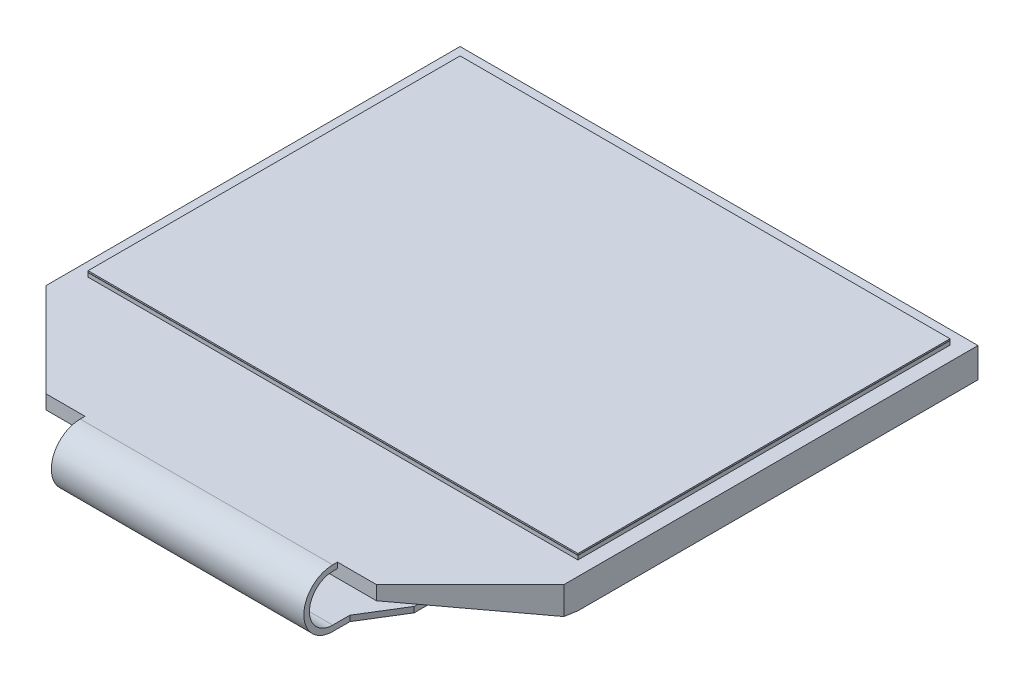
ISO-10303-21;
HEADER;
FILE_DESCRIPTION(('STEP AP214'),'2;1');
FILE_NAME('part.step','',(''),(''),'','','');
FILE_SCHEMA(('AUTOMOTIVE_DESIGN { 1 0 10303 214 1 1 1 1 }'));
ENDSEC;
DATA;
#1=APPLICATION_CONTEXT('core data for automotive mechanical design processes');
#2=APPLICATION_PROTOCOL_DEFINITION('international standard','automotive_design',2000,#1);
#3=PRODUCT_CONTEXT('',#1,'mechanical');
#4=PRODUCT('Part','Part','',(#3));
#5=PRODUCT_RELATED_PRODUCT_CATEGORY('part','',(#4));
#6=PRODUCT_DEFINITION_FORMATION('','',#4);
#7=PRODUCT_DEFINITION_CONTEXT('part definition',#1,'design');
#8=PRODUCT_DEFINITION('design','',#6,#7);
#9=PRODUCT_DEFINITION_SHAPE('','',#8);
#10=(LENGTH_UNIT() NAMED_UNIT(*) SI_UNIT(.MILLI.,.METRE.));
#11=(NAMED_UNIT(*) PLANE_ANGLE_UNIT() SI_UNIT($,.RADIAN.));
#12=(NAMED_UNIT(*) SI_UNIT($,.STERADIAN.) SOLID_ANGLE_UNIT());
#13=UNCERTAINTY_MEASURE_WITH_UNIT(LENGTH_MEASURE(1.E-05),#10,'distance_accuracy_value','');
#14=(GEOMETRIC_REPRESENTATION_CONTEXT(3) GLOBAL_UNCERTAINTY_ASSIGNED_CONTEXT((#13)) GLOBAL_UNIT_ASSIGNED_CONTEXT((#10,
#11,#12)) REPRESENTATION_CONTEXT('',''));
#15=CARTESIAN_POINT('',(0.,0.,0.));
#16=DIRECTION('',(0.,0.,1.));
#17=DIRECTION('',(1.,0.,0.));
#18=AXIS2_PLACEMENT_3D('',#15,#16,#17);
#19=CARTESIAN_POINT('',(8.73,0.71,0.5));
#20=DIRECTION('',(0.,0.,1.));
#21=DIRECTION('',(1.,0.,0.));
#22=AXIS2_PLACEMENT_3D('',#19,#20,#21);
#23=PLANE('',#22);
#24=DIRECTION('',(-1.,0.,0.));
#25=VECTOR('',#24,1.);
#26=CARTESIAN_POINT('',(8.73,0.66,0.5));
#27=LINE('',#26,#25);
#28=CARTESIAN_POINT('',(8.73,0.66,0.5));
#29=VERTEX_POINT('',#28);
#30=CARTESIAN_POINT('',(-8.73,0.66,0.5));
#31=VERTEX_POINT('',#30);
#32=EDGE_CURVE('E108',#29,#31,#27,.T.);
#33=ORIENTED_EDGE('',*,*,#32,.T.);
#34=DIRECTION('',(0.,-1.,0.));
#35=VECTOR('',#34,1.);
#36=CARTESIAN_POINT('',(-8.73,0.71,0.5));
#37=LINE('',#36,#35);
#38=CARTESIAN_POINT('',(-8.73,0.71,0.5));
#39=VERTEX_POINT('',#38);
#40=EDGE_CURVE('E106',#39,#31,#37,.T.);
#41=ORIENTED_EDGE('',*,*,#40,.F.);
#42=DIRECTION('',(-1.,0.,0.));
#43=VECTOR('',#42,1.);
#44=CARTESIAN_POINT('',(8.73,0.71,0.5));
#45=LINE('',#44,#43);
#46=CARTESIAN_POINT('',(8.73,0.71,0.5));
#47=VERTEX_POINT('',#46);
#48=EDGE_CURVE('E92',#47,#39,#45,.T.);
#49=ORIENTED_EDGE('',*,*,#48,.F.);
#50=DIRECTION('',(0.,-1.,0.));
#51=VECTOR('',#50,1.);
#52=CARTESIAN_POINT('',(8.73,0.71,0.5));
#53=LINE('',#52,#51);
#54=EDGE_CURVE('E60',#47,#29,#53,.T.);
#55=ORIENTED_EDGE('',*,*,#54,.T.);
#56=EDGE_LOOP('',(#33,#41,#49,#55));
#57=FACE_BOUND('',#56,.T.);
#58=ADVANCED_FACE('F52',(#57),#23,.F.);
#59=CARTESIAN_POINT('',(0.,0.71,13.76));
#60=DIRECTION('',(0.,0.,-1.));
#61=DIRECTION('',(-1.,0.,0.));
#62=AXIS2_PLACEMENT_3D('',#59,#60,#61);
#63=PLANE('',#62);
#64=DIRECTION('',(1.,0.,0.));
#65=VECTOR('',#64,1.);
#66=CARTESIAN_POINT('',(0.,0.66,13.76));
#67=LINE('',#66,#65);
#68=CARTESIAN_POINT('',(-8.73,0.66,13.76));
#69=VERTEX_POINT('',#68);
#70=CARTESIAN_POINT('',(8.73,0.66,13.76));
#71=VERTEX_POINT('',#70);
#72=EDGE_CURVE('E79',#69,#71,#67,.T.);
#73=ORIENTED_EDGE('',*,*,#72,.T.);
#74=DIRECTION('',(0.,-1.,0.));
#75=VECTOR('',#74,1.);
#76=CARTESIAN_POINT('',(8.73,0.71,13.76));
#77=LINE('',#76,#75);
#78=CARTESIAN_POINT('',(8.73,0.71,13.76));
#79=VERTEX_POINT('',#78);
#80=EDGE_CURVE('E12',#79,#71,#77,.T.);
#81=ORIENTED_EDGE('',*,*,#80,.F.);
#82=DIRECTION('',(1.,0.,0.));
#83=VECTOR('',#82,1.);
#84=CARTESIAN_POINT('',(0.,0.71,13.76));
#85=LINE('',#84,#83);
#86=CARTESIAN_POINT('',(-8.73,0.71,13.76));
#87=VERTEX_POINT('',#86);
#88=EDGE_CURVE('E83',#87,#79,#85,.T.);
#89=ORIENTED_EDGE('',*,*,#88,.F.);
#90=DIRECTION('',(0.,-1.,0.));
#91=VECTOR('',#90,1.);
#92=CARTESIAN_POINT('',(-8.73,0.71,13.76));
#93=LINE('',#92,#91);
#94=EDGE_CURVE('E107',#87,#69,#93,.T.);
#95=ORIENTED_EDGE('',*,*,#94,.T.);
#96=EDGE_LOOP('',(#73,#81,#89,#95));
#97=FACE_BOUND('',#96,.T.);
#98=ADVANCED_FACE('F125',(#97),#63,.F.);
#99=CARTESIAN_POINT('',(8.73,0.71,13.76));
#100=DIRECTION('',(-1.,0.,0.));
#101=DIRECTION('',(0.,0.,1.));
#102=AXIS2_PLACEMENT_3D('',#99,#100,#101);
#103=PLANE('',#102);
#104=DIRECTION('',(0.,0.,-1.));
#105=VECTOR('',#104,1.);
#106=CARTESIAN_POINT('',(8.73,0.66,13.76));
#107=LINE('',#106,#105);
#108=EDGE_CURVE('E100',#71,#29,#107,.T.);
#109=ORIENTED_EDGE('',*,*,#108,.T.);
#110=ORIENTED_EDGE('',*,*,#54,.F.);
#111=DIRECTION('',(0.,0.,-1.));
#112=VECTOR('',#111,1.);
#113=CARTESIAN_POINT('',(8.73,0.71,13.76));
#114=LINE('',#113,#112);
#115=EDGE_CURVE('E68',#79,#47,#114,.T.);
#116=ORIENTED_EDGE('',*,*,#115,.F.);
#117=ORIENTED_EDGE('',*,*,#80,.T.);
#118=EDGE_LOOP('',(#109,#110,#116,#117));
#119=FACE_BOUND('',#118,.T.);
#120=ADVANCED_FACE('F127',(#119),#103,.F.);
#121=CARTESIAN_POINT('',(0.,0.71,0.));
#122=DIRECTION('',(0.,1.,0.));
#123=DIRECTION('',(0.,0.,1.));
#124=AXIS2_PLACEMENT_3D('',#121,#122,#123);
#125=PLANE('',#124);
#126=ORIENTED_EDGE('',*,*,#48,.T.);
#127=DIRECTION('',(0.,0.,-1.));
#128=VECTOR('',#127,1.);
#129=CARTESIAN_POINT('',(-8.73,0.71,13.76));
#130=LINE('',#129,#128);
#131=EDGE_CURVE('E95',#87,#39,#130,.T.);
#132=ORIENTED_EDGE('',*,*,#131,.F.);
#133=ORIENTED_EDGE('',*,*,#88,.T.);
#134=ORIENTED_EDGE('',*,*,#115,.T.);
#135=EDGE_LOOP('',(#126,#132,#133,#134));
#136=FACE_BOUND('',#135,.T.);
#137=ADVANCED_FACE('F94',(#136),#125,.T.);
#138=CARTESIAN_POINT('',(0.,0.66,0.));
#139=DIRECTION('',(0.,1.,0.));
#140=DIRECTION('',(0.,0.,1.));
#141=AXIS2_PLACEMENT_3D('',#138,#139,#140);
#142=PLANE('',#141);
#143=ORIENTED_EDGE('',*,*,#32,.F.);
#144=ORIENTED_EDGE('',*,*,#108,.F.);
#145=ORIENTED_EDGE('',*,*,#72,.F.);
#146=DIRECTION('',(0.,0.,-1.));
#147=VECTOR('',#146,1.);
#148=CARTESIAN_POINT('',(-8.73,0.66,13.76));
#149=LINE('',#148,#147);
#150=EDGE_CURVE('E109',#69,#31,#149,.T.);
#151=ORIENTED_EDGE('',*,*,#150,.T.);
#152=EDGE_LOOP('',(#143,#144,#145,#151));
#153=FACE_BOUND('',#152,.T.);
#154=ADVANCED_FACE('F124',(#153),#142,.F.);
#155=CARTESIAN_POINT('',(-8.73,0.71,13.76));
#156=DIRECTION('',(1.,0.,0.));
#157=DIRECTION('',(0.,0.,1.));
#158=AXIS2_PLACEMENT_3D('',#155,#156,#157);
#159=PLANE('',#158);
#160=ORIENTED_EDGE('',*,*,#150,.F.);
#161=ORIENTED_EDGE('',*,*,#94,.F.);
#162=ORIENTED_EDGE('',*,*,#131,.T.);
#163=ORIENTED_EDGE('',*,*,#40,.T.);
#164=EDGE_LOOP('',(#160,#161,#162,#163));
#165=FACE_BOUND('',#164,.T.);
#166=ADVANCED_FACE('F105',(#165),#159,.F.);
#167=CLOSED_SHELL('',(#58,#98,#120,#137,#154,#166));
#168=MANIFOLD_SOLID_BREP('B2',#167);
#169=CARTESIAN_POINT('',(0.,0.65,13.76));
#170=DIRECTION('',(0.,0.,-1.));
#171=DIRECTION('',(-1.,0.,0.));
#172=AXIS2_PLACEMENT_3D('',#169,#170,#171);
#173=PLANE('',#172);
#174=DIRECTION('',(1.,0.,0.));
#175=VECTOR('',#174,1.);
#176=CARTESIAN_POINT('',(0.,0.51,13.76));
#177=LINE('',#176,#175);
#178=CARTESIAN_POINT('',(-8.73,0.51,13.76));
#179=VERTEX_POINT('',#178);
#180=CARTESIAN_POINT('',(8.73,0.51,13.76));
#181=VERTEX_POINT('',#180);
#182=EDGE_CURVE('E216',#179,#181,#177,.T.);
#183=ORIENTED_EDGE('',*,*,#182,.T.);
#184=DIRECTION('',(0.,-1.,0.));
#185=VECTOR('',#184,1.);
#186=CARTESIAN_POINT('',(8.73,0.65,13.76));
#187=LINE('',#186,#185);
#188=CARTESIAN_POINT('',(8.73,0.65,13.76));
#189=VERTEX_POINT('',#188);
#190=EDGE_CURVE('E50',#189,#181,#187,.T.);
#191=ORIENTED_EDGE('',*,*,#190,.F.);
#192=DIRECTION('',(1.,0.,0.));
#193=VECTOR('',#192,1.);
#194=CARTESIAN_POINT('',(0.,0.65,13.76));
#195=LINE('',#194,#193);
#196=CARTESIAN_POINT('',(-8.73,0.65,13.76));
#197=VERTEX_POINT('',#196);
#198=EDGE_CURVE('E248',#197,#189,#195,.T.);
#199=ORIENTED_EDGE('',*,*,#198,.F.);
#200=DIRECTION('',(0.,-1.,0.));
#201=VECTOR('',#200,1.);
#202=CARTESIAN_POINT('',(-8.73,0.65,13.76));
#203=LINE('',#202,#201);
#204=EDGE_CURVE('E245',#197,#179,#203,.T.);
#205=ORIENTED_EDGE('',*,*,#204,.T.);
#206=EDGE_LOOP('',(#183,#191,#199,#205));
#207=FACE_BOUND('',#206,.T.);
#208=ADVANCED_FACE('F189',(#207),#173,.F.);
#209=CARTESIAN_POINT('',(8.73,0.65,0.5));
#210=DIRECTION('',(-1.,0.,0.));
#211=DIRECTION('',(0.,0.,1.));
#212=AXIS2_PLACEMENT_3D('',#209,#210,#211);
#213=PLANE('',#212);
#214=DIRECTION('',(0.,0.,-1.));
#215=VECTOR('',#214,1.);
#216=CARTESIAN_POINT('',(8.73,0.51,0.5));
#217=LINE('',#216,#215);
#218=CARTESIAN_POINT('',(8.73,0.51,0.5));
#219=VERTEX_POINT('',#218);
#220=EDGE_CURVE('E237',#181,#219,#217,.T.);
#221=ORIENTED_EDGE('',*,*,#220,.T.);
#222=DIRECTION('',(0.,-1.,0.));
#223=VECTOR('',#222,1.);
#224=CARTESIAN_POINT('',(8.73,0.65,0.5));
#225=LINE('',#224,#223);
#226=CARTESIAN_POINT('',(8.73,0.65,0.5));
#227=VERTEX_POINT('',#226);
#228=EDGE_CURVE('E197',#227,#219,#225,.T.);
#229=ORIENTED_EDGE('',*,*,#228,.F.);
#230=DIRECTION('',(0.,0.,-1.));
#231=VECTOR('',#230,1.);
#232=CARTESIAN_POINT('',(8.73,0.65,0.5));
#233=LINE('',#232,#231);
#234=EDGE_CURVE('E205',#189,#227,#233,.T.);
#235=ORIENTED_EDGE('',*,*,#234,.F.);
#236=ORIENTED_EDGE('',*,*,#190,.T.);
#237=EDGE_LOOP('',(#221,#229,#235,#236));
#238=FACE_BOUND('',#237,.T.);
#239=ADVANCED_FACE('F262',(#238),#213,.F.);
#240=CARTESIAN_POINT('',(0.,0.65,0.5));
#241=DIRECTION('',(0.,0.,1.));
#242=DIRECTION('',(1.,0.,0.));
#243=AXIS2_PLACEMENT_3D('',#240,#241,#242);
#244=PLANE('',#243);
#245=DIRECTION('',(-1.,0.,0.));
#246=VECTOR('',#245,1.);
#247=CARTESIAN_POINT('',(0.,0.51,0.5));
#248=LINE('',#247,#246);
#249=CARTESIAN_POINT('',(-8.73,0.51,0.5));
#250=VERTEX_POINT('',#249);
#251=EDGE_CURVE('E254',#219,#250,#248,.T.);
#252=ORIENTED_EDGE('',*,*,#251,.T.);
#253=DIRECTION('',(0.,-1.,0.));
#254=VECTOR('',#253,1.);
#255=CARTESIAN_POINT('',(-8.73,0.65,0.5));
#256=LINE('',#255,#254);
#257=CARTESIAN_POINT('',(-8.73,0.65,0.5));
#258=VERTEX_POINT('',#257);
#259=EDGE_CURVE('E246',#258,#250,#256,.T.);
#260=ORIENTED_EDGE('',*,*,#259,.F.);
#261=DIRECTION('',(-1.,0.,0.));
#262=VECTOR('',#261,1.);
#263=CARTESIAN_POINT('',(0.,0.65,0.5));
#264=LINE('',#263,#262);
#265=EDGE_CURVE('E221',#227,#258,#264,.T.);
#266=ORIENTED_EDGE('',*,*,#265,.F.);
#267=ORIENTED_EDGE('',*,*,#228,.T.);
#268=EDGE_LOOP('',(#252,#260,#266,#267));
#269=FACE_BOUND('',#268,.T.);
#270=ADVANCED_FACE('F260',(#269),#244,.F.);
#271=CARTESIAN_POINT('',(0.,0.65,0.));
#272=DIRECTION('',(0.,1.,0.));
#273=DIRECTION('',(0.,0.,1.));
#274=AXIS2_PLACEMENT_3D('',#271,#272,#273);
#275=PLANE('',#274);
#276=ORIENTED_EDGE('',*,*,#265,.T.);
#277=DIRECTION('',(0.,0.,-1.));
#278=VECTOR('',#277,1.);
#279=CARTESIAN_POINT('',(-8.73,0.65,0.5));
#280=LINE('',#279,#278);
#281=EDGE_CURVE('E238',#197,#258,#280,.T.);
#282=ORIENTED_EDGE('',*,*,#281,.F.);
#283=ORIENTED_EDGE('',*,*,#198,.T.);
#284=ORIENTED_EDGE('',*,*,#234,.T.);
#285=EDGE_LOOP('',(#276,#282,#283,#284));
#286=FACE_BOUND('',#285,.T.);
#287=ADVANCED_FACE('F268',(#286),#275,.T.);
#288=CARTESIAN_POINT('',(0.,0.51,0.));
#289=DIRECTION('',(0.,1.,0.));
#290=DIRECTION('',(0.,0.,1.));
#291=AXIS2_PLACEMENT_3D('',#288,#289,#290);
#292=PLANE('',#291);
#293=ORIENTED_EDGE('',*,*,#182,.F.);
#294=DIRECTION('',(0.,0.,-1.));
#295=VECTOR('',#294,1.);
#296=CARTESIAN_POINT('',(-8.73,0.51,0.5));
#297=LINE('',#296,#295);
#298=EDGE_CURVE('E236',#179,#250,#297,.T.);
#299=ORIENTED_EDGE('',*,*,#298,.T.);
#300=ORIENTED_EDGE('',*,*,#251,.F.);
#301=ORIENTED_EDGE('',*,*,#220,.F.);
#302=EDGE_LOOP('',(#293,#299,#300,#301));
#303=FACE_BOUND('',#302,.T.);
#304=ADVANCED_FACE('F234',(#303),#292,.F.);
#305=CARTESIAN_POINT('',(-8.73,0.65,0.5));
#306=DIRECTION('',(1.,0.,0.));
#307=DIRECTION('',(0.,0.,1.));
#308=AXIS2_PLACEMENT_3D('',#305,#306,#307);
#309=PLANE('',#308);
#310=ORIENTED_EDGE('',*,*,#298,.F.);
#311=ORIENTED_EDGE('',*,*,#204,.F.);
#312=ORIENTED_EDGE('',*,*,#281,.T.);
#313=ORIENTED_EDGE('',*,*,#259,.T.);
#314=EDGE_LOOP('',(#310,#311,#312,#313));
#315=FACE_BOUND('',#314,.T.);
#316=ADVANCED_FACE('F243',(#315),#309,.F.);
#317=CLOSED_SHELL('',(#208,#239,#270,#287,#304,#316));
#318=MANIFOLD_SOLID_BREP('B6',#317);
#319=CARTESIAN_POINT('',(0.,0.5,18.1));
#320=DIRECTION('',(0.,0.,-1.));
#321=DIRECTION('',(-1.,0.,0.));
#322=AXIS2_PLACEMENT_3D('',#319,#320,#321);
#323=PLANE('',#322);
#324=DIRECTION('',(-1.,0.,0.));
#325=VECTOR('',#324,1.);
#326=CARTESIAN_POINT('',(4.5,0.3,18.1));
#327=LINE('',#326,#325);
#328=CARTESIAN_POINT('',(4.5,0.3,18.1));
#329=VERTEX_POINT('',#328);
#330=CARTESIAN_POINT('',(-4.5,0.3,18.1));
#331=VERTEX_POINT('',#330);
#332=EDGE_CURVE('E570',#329,#331,#327,.T.);
#333=ORIENTED_EDGE('',*,*,#332,.T.);
#334=DIRECTION('',(0.,1.,0.));
#335=VECTOR('',#334,1.);
#336=CARTESIAN_POINT('',(-4.5,0.3,18.1));
#337=LINE('',#336,#335);
#338=CARTESIAN_POINT('',(-4.5,0.5,18.1));
#339=VERTEX_POINT('',#338);
#340=EDGE_CURVE('E341',#331,#339,#337,.T.);
#341=ORIENTED_EDGE('',*,*,#340,.T.);
#342=DIRECTION('',(1.,0.,0.));
#343=VECTOR('',#342,1.);
#344=CARTESIAN_POINT('',(0.,0.5,18.1));
#345=LINE('',#344,#343);
#346=CARTESIAN_POINT('',(-5.89,0.5,18.1));
#347=VERTEX_POINT('',#346);
#348=EDGE_CURVE('E658',#347,#339,#345,.T.);
#349=ORIENTED_EDGE('',*,*,#348,.F.);
#350=DIRECTION('',(0.,-1.,0.));
#351=VECTOR('',#350,1.);
#352=CARTESIAN_POINT('',(-5.89,0.5,18.1));
#353=LINE('',#352,#351);
#354=CARTESIAN_POINT('',(-5.89,0.,18.1));
#355=VERTEX_POINT('',#354);
#356=EDGE_CURVE('E624',#347,#355,#353,.T.);
#357=ORIENTED_EDGE('',*,*,#356,.T.);
#358=DIRECTION('',(1.,0.,0.));
#359=VECTOR('',#358,1.);
#360=CARTESIAN_POINT('',(0.,0.,18.1));
#361=LINE('',#360,#359);
#362=CARTESIAN_POINT('',(5.89,0.,18.1));
#363=VERTEX_POINT('',#362);
#364=EDGE_CURVE('E657',#355,#363,#361,.T.);
#365=ORIENTED_EDGE('',*,*,#364,.T.);
#366=DIRECTION('',(0.,-1.,0.));
#367=VECTOR('',#366,1.);
#368=CARTESIAN_POINT('',(5.89,0.5,18.1));
#369=LINE('',#368,#367);
#370=CARTESIAN_POINT('',(5.89,0.5,18.1));
#371=VERTEX_POINT('',#370);
#372=EDGE_CURVE('E334',#371,#363,#369,.T.);
#373=ORIENTED_EDGE('',*,*,#372,.F.);
#374=CARTESIAN_POINT('',(4.5,0.5,18.1));
#375=VERTEX_POINT('',#374);
#376=EDGE_CURVE('E662',#375,#371,#345,.T.);
#377=ORIENTED_EDGE('',*,*,#376,.F.);
#378=DIRECTION('',(0.,1.,0.));
#379=VECTOR('',#378,1.);
#380=CARTESIAN_POINT('',(4.5,0.3,18.1));
#381=LINE('',#380,#379);
#382=EDGE_CURVE('E557',#329,#375,#381,.T.);
#383=ORIENTED_EDGE('',*,*,#382,.F.);
#384=EDGE_LOOP('',(#333,#341,#349,#357,#365,#373,#377,#383));
#385=FACE_BOUND('',#384,.T.);
#386=ADVANCED_FACE('F327',(#385),#323,.F.);
#387=CARTESIAN_POINT('',(9.23,0.5,14.76));
#388=DIRECTION('',(-0.707106781186543,0.,-0.707106781186552));
#389=DIRECTION('',(-0.707106781186552,0.,0.707106781186543));
#390=AXIS2_PLACEMENT_3D('',#387,#388,#389);
#391=PLANE('',#390);
#392=ORIENTED_EDGE('',*,*,#372,.T.);
#393=DIRECTION('',(0.703376927704101,-0.102575801956847,-0.703376927704093));
#394=VECTOR('',#393,1.);
#395=CARTESIAN_POINT('',(9.46232231931654,-0.520963671566989,14.5276776806835));
#396=LINE('',#395,#394);
#397=CARTESIAN_POINT('',(9.23,-0.487083333333328,14.76));
#398=VERTEX_POINT('',#397);
#399=EDGE_CURVE('E187',#363,#398,#396,.T.);
#400=ORIENTED_EDGE('',*,*,#399,.T.);
#401=DIRECTION('',(0.,-1.,0.));
#402=VECTOR('',#401,1.);
#403=CARTESIAN_POINT('',(9.23,0.5,14.76));
#404=LINE('',#403,#402);
#405=CARTESIAN_POINT('',(9.23,0.5,14.76));
#406=VERTEX_POINT('',#405);
#407=EDGE_CURVE('E671',#406,#398,#404,.T.);
#408=ORIENTED_EDGE('',*,*,#407,.F.);
#409=DIRECTION('',(0.707106781186552,0.,-0.707106781186543));
#410=VECTOR('',#409,1.);
#411=CARTESIAN_POINT('',(9.23,0.5,14.76));
#412=LINE('',#411,#410);
#413=EDGE_CURVE('E661',#371,#406,#412,.T.);
#414=ORIENTED_EDGE('',*,*,#413,.F.);
#415=EDGE_LOOP('',(#392,#400,#408,#414));
#416=FACE_BOUND('',#415,.T.);
#417=ADVANCED_FACE('F676',(#416),#391,.F.);
#418=CARTESIAN_POINT('',(9.23,0.5,0.));
#419=DIRECTION('',(-1.,0.,0.));
#420=DIRECTION('',(0.,0.,1.));
#421=AXIS2_PLACEMENT_3D('',#418,#419,#420);
#422=PLANE('',#421);
#423=ORIENTED_EDGE('',*,*,#407,.T.);
#424=DIRECTION('',(0.,-0.144306893071729,-0.989532981063282));
#425=VECTOR('',#424,1.);
#426=CARTESIAN_POINT('',(9.23,0.,18.1));
#427=LINE('',#426,#425);
#428=CARTESIAN_POINT('',(9.23,-0.56,14.26));
#429=VERTEX_POINT('',#428);
#430=EDGE_CURVE('E627',#398,#429,#427,.T.);
#431=ORIENTED_EDGE('',*,*,#430,.T.);
#432=DIRECTION('',(0.,0.,1.));
#433=VECTOR('',#432,1.);
#434=CARTESIAN_POINT('',(9.23,-0.56,0.));
#435=LINE('',#434,#433);
#436=CARTESIAN_POINT('',(9.23,-0.56,0.));
#437=VERTEX_POINT('',#436);
#438=EDGE_CURVE('E652',#437,#429,#435,.T.);
#439=ORIENTED_EDGE('',*,*,#438,.F.);
#440=DIRECTION('',(0.,-1.,0.));
#441=VECTOR('',#440,1.);
#442=CARTESIAN_POINT('',(9.23,0.5,0.));
#443=LINE('',#442,#441);
#444=CARTESIAN_POINT('',(9.23,0.5,0.));
#445=VERTEX_POINT('',#444);
#446=EDGE_CURVE('E667',#445,#437,#443,.T.);
#447=ORIENTED_EDGE('',*,*,#446,.F.);
#448=DIRECTION('',(0.,0.,-1.));
#449=VECTOR('',#448,1.);
#450=CARTESIAN_POINT('',(9.23,0.5,0.));
#451=LINE('',#450,#449);
#452=EDGE_CURVE('E349',#406,#445,#451,.T.);
#453=ORIENTED_EDGE('',*,*,#452,.F.);
#454=EDGE_LOOP('',(#423,#431,#439,#447,#453));
#455=FACE_BOUND('',#454,.T.);
#456=ADVANCED_FACE('F698',(#455),#422,.F.);
#457=CARTESIAN_POINT('',(0.,0.5,0.));
#458=DIRECTION('',(0.,0.,1.));
#459=DIRECTION('',(1.,0.,0.));
#460=AXIS2_PLACEMENT_3D('',#457,#458,#459);
#461=PLANE('',#460);
#462=ORIENTED_EDGE('',*,*,#446,.T.);
#463=DIRECTION('',(1.,0.,0.));
#464=VECTOR('',#463,1.);
#465=CARTESIAN_POINT('',(0.,-0.56,0.));
#466=LINE('',#465,#464);
#467=CARTESIAN_POINT('',(-9.23,-0.56,0.));
#468=VERTEX_POINT('',#467);
#469=EDGE_CURVE('E648',#468,#437,#466,.T.);
#470=ORIENTED_EDGE('',*,*,#469,.F.);
#471=DIRECTION('',(0.,-1.,0.));
#472=VECTOR('',#471,1.);
#473=CARTESIAN_POINT('',(-9.23,0.5,0.));
#474=LINE('',#473,#472);
#475=CARTESIAN_POINT('',(-9.23,0.5,0.));
#476=VERTEX_POINT('',#475);
#477=EDGE_CURVE('E597',#476,#468,#474,.T.);
#478=ORIENTED_EDGE('',*,*,#477,.F.);
#479=DIRECTION('',(-1.,0.,0.));
#480=VECTOR('',#479,1.);
#481=CARTESIAN_POINT('',(0.,0.5,0.));
#482=LINE('',#481,#480);
#483=EDGE_CURVE('E665',#445,#476,#482,.T.);
#484=ORIENTED_EDGE('',*,*,#483,.F.);
#485=EDGE_LOOP('',(#462,#470,#478,#484));
#486=FACE_BOUND('',#485,.T.);
#487=ADVANCED_FACE('F702',(#486),#461,.F.);
#488=CARTESIAN_POINT('',(0.,0.5,0.));
#489=DIRECTION('',(0.,1.,0.));
#490=DIRECTION('',(0.,0.,1.));
#491=AXIS2_PLACEMENT_3D('',#488,#489,#490);
#492=PLANE('',#491);
#493=DIRECTION('',(0.,0.,-1.));
#494=VECTOR('',#493,1.);
#495=CARTESIAN_POINT('',(-6.71,0.5,2.1));
#496=LINE('',#495,#494);
#497=CARTESIAN_POINT('',(-6.71,0.5,12.16));
#498=VERTEX_POINT('',#497);
#499=CARTESIAN_POINT('',(-6.71,0.5,2.1));
#500=VERTEX_POINT('',#499);
#501=EDGE_CURVE('E615',#498,#500,#496,.T.);
#502=ORIENTED_EDGE('',*,*,#501,.T.);
#503=DIRECTION('',(-1.,0.,0.));
#504=VECTOR('',#503,1.);
#505=CARTESIAN_POINT('',(0.,0.5,2.1));
#506=LINE('',#505,#504);
#507=CARTESIAN_POINT('',(6.71,0.5,2.1));
#508=VERTEX_POINT('',#507);
#509=EDGE_CURVE('E634',#508,#500,#506,.T.);
#510=ORIENTED_EDGE('',*,*,#509,.F.);
#511=DIRECTION('',(0.,0.,-1.));
#512=VECTOR('',#511,1.);
#513=CARTESIAN_POINT('',(6.71,0.5,2.1));
#514=LINE('',#513,#512);
#515=CARTESIAN_POINT('',(6.71,0.5,12.16));
#516=VERTEX_POINT('',#515);
#517=EDGE_CURVE('E642',#516,#508,#514,.T.);
#518=ORIENTED_EDGE('',*,*,#517,.F.);
#519=DIRECTION('',(1.,0.,0.));
#520=VECTOR('',#519,1.);
#521=CARTESIAN_POINT('',(0.,0.5,12.16));
#522=LINE('',#521,#520);
#523=EDGE_CURVE('E629',#498,#516,#522,.T.);
#524=ORIENTED_EDGE('',*,*,#523,.F.);
#525=EDGE_LOOP('',(#502,#510,#518,#524));
#526=FACE_BOUND('',#525,.T.);
#527=ORIENTED_EDGE('',*,*,#483,.T.);
#528=DIRECTION('',(0.,0.,-1.));
#529=VECTOR('',#528,1.);
#530=CARTESIAN_POINT('',(-9.23,0.5,0.));
#531=LINE('',#530,#529);
#532=CARTESIAN_POINT('',(-9.23,0.5,14.76));
#533=VERTEX_POINT('',#532);
#534=EDGE_CURVE('E603',#533,#476,#531,.T.);
#535=ORIENTED_EDGE('',*,*,#534,.F.);
#536=DIRECTION('',(-0.707106781186552,0.,-0.707106781186543));
#537=VECTOR('',#536,1.);
#538=CARTESIAN_POINT('',(-9.23,0.5,14.76));
#539=LINE('',#538,#537);
#540=EDGE_CURVE('E621',#347,#533,#539,.T.);
#541=ORIENTED_EDGE('',*,*,#540,.F.);
#542=ORIENTED_EDGE('',*,*,#348,.T.);
#543=DIRECTION('',(0.,0.,1.));
#544=VECTOR('',#543,1.);
#545=CARTESIAN_POINT('',(-4.5,0.5,18.27));
#546=LINE('',#545,#544);
#547=CARTESIAN_POINT('',(-4.5,0.5,18.27));
#548=VERTEX_POINT('',#547);
#549=EDGE_CURVE('E572',#339,#548,#546,.T.);
#550=ORIENTED_EDGE('',*,*,#549,.T.);
#551=DIRECTION('',(-1.,0.,0.));
#552=VECTOR('',#551,1.);
#553=CARTESIAN_POINT('',(4.5,0.5,18.27));
#554=LINE('',#553,#552);
#555=CARTESIAN_POINT('',(4.5,0.5,18.27));
#556=VERTEX_POINT('',#555);
#557=EDGE_CURVE('E588',#556,#548,#554,.T.);
#558=ORIENTED_EDGE('',*,*,#557,.F.);
#559=DIRECTION('',(0.,0.,1.));
#560=VECTOR('',#559,1.);
#561=CARTESIAN_POINT('',(4.5,0.5,18.27));
#562=LINE('',#561,#560);
#563=EDGE_CURVE('E560',#375,#556,#562,.T.);
#564=ORIENTED_EDGE('',*,*,#563,.F.);
#565=ORIENTED_EDGE('',*,*,#376,.T.);
#566=ORIENTED_EDGE('',*,*,#413,.T.);
#567=ORIENTED_EDGE('',*,*,#452,.T.);
#568=EDGE_LOOP('',(#527,#535,#541,#542,#550,#558,#564,#565,#566,#567));
#569=FACE_BOUND('',#568,.T.);
#570=ADVANCED_FACE('F703',(#526,#569),#492,.T.);
#571=CARTESIAN_POINT('',(0.,-0.56,0.));
#572=DIRECTION('',(0.,1.,0.));
#573=DIRECTION('',(0.,0.,1.));
#574=AXIS2_PLACEMENT_3D('',#571,#572,#573);
#575=PLANE('',#574);
#576=DIRECTION('',(-1.,0.,0.));
#577=VECTOR('',#576,1.);
#578=CARTESIAN_POINT('',(0.,-0.56,14.26));
#579=LINE('',#578,#577);
#580=CARTESIAN_POINT('',(-9.23,-0.56,14.26));
#581=VERTEX_POINT('',#580);
#582=EDGE_CURVE('E655',#429,#581,#579,.T.);
#583=ORIENTED_EDGE('',*,*,#582,.T.);
#584=DIRECTION('',(0.,0.,1.));
#585=VECTOR('',#584,1.);
#586=CARTESIAN_POINT('',(-9.23,-0.56,0.));
#587=LINE('',#586,#585);
#588=EDGE_CURVE('E594',#468,#581,#587,.T.);
#589=ORIENTED_EDGE('',*,*,#588,.F.);
#590=ORIENTED_EDGE('',*,*,#469,.T.);
#591=ORIENTED_EDGE('',*,*,#438,.T.);
#592=EDGE_LOOP('',(#583,#589,#590,#591));
#593=FACE_BOUND('',#592,.T.);
#594=ADVANCED_FACE('F696',(#593),#575,.F.);
#595=CARTESIAN_POINT('',(0.,0.48,2.1));
#596=DIRECTION('',(0.,0.,-1.));
#597=DIRECTION('',(-1.,0.,0.));
#598=AXIS2_PLACEMENT_3D('',#595,#596,#597);
#599=PLANE('',#598);
#600=ORIENTED_EDGE('',*,*,#509,.T.);
#601=DIRECTION('',(0.,1.,0.));
#602=VECTOR('',#601,1.);
#603=CARTESIAN_POINT('',(-6.71,0.48,2.1));
#604=LINE('',#603,#602);
#605=CARTESIAN_POINT('',(-6.71,0.48,2.1));
#606=VERTEX_POINT('',#605);
#607=EDGE_CURVE('E618',#606,#500,#604,.T.);
#608=ORIENTED_EDGE('',*,*,#607,.F.);
#609=DIRECTION('',(-1.,0.,0.));
#610=VECTOR('',#609,1.);
#611=CARTESIAN_POINT('',(0.,0.48,2.1));
#612=LINE('',#611,#610);
#613=CARTESIAN_POINT('',(6.71,0.48,2.1));
#614=VERTEX_POINT('',#613);
#615=EDGE_CURVE('E637',#614,#606,#612,.T.);
#616=ORIENTED_EDGE('',*,*,#615,.F.);
#617=DIRECTION('',(0.,1.,0.));
#618=VECTOR('',#617,1.);
#619=CARTESIAN_POINT('',(6.71,0.48,2.1));
#620=LINE('',#619,#618);
#621=EDGE_CURVE('E646',#614,#508,#620,.T.);
#622=ORIENTED_EDGE('',*,*,#621,.T.);
#623=EDGE_LOOP('',(#600,#608,#616,#622));
#624=FACE_BOUND('',#623,.T.);
#625=ADVANCED_FACE('F762',(#624),#599,.F.);
#626=CARTESIAN_POINT('',(6.71,0.48,2.1));
#627=DIRECTION('',(1.,0.,0.));
#628=DIRECTION('',(0.,0.,-1.));
#629=AXIS2_PLACEMENT_3D('',#626,#627,#628);
#630=PLANE('',#629);
#631=ORIENTED_EDGE('',*,*,#517,.T.);
#632=ORIENTED_EDGE('',*,*,#621,.F.);
#633=DIRECTION('',(0.,0.,-1.));
#634=VECTOR('',#633,1.);
#635=CARTESIAN_POINT('',(6.71,0.48,2.1));
#636=LINE('',#635,#634);
#637=CARTESIAN_POINT('',(6.71,0.48,12.16));
#638=VERTEX_POINT('',#637);
#639=EDGE_CURVE('E633',#638,#614,#636,.T.);
#640=ORIENTED_EDGE('',*,*,#639,.F.);
#641=DIRECTION('',(0.,1.,0.));
#642=VECTOR('',#641,1.);
#643=CARTESIAN_POINT('',(6.71,0.48,12.16));
#644=LINE('',#643,#642);
#645=EDGE_CURVE('E639',#638,#516,#644,.T.);
#646=ORIENTED_EDGE('',*,*,#645,.T.);
#647=EDGE_LOOP('',(#631,#632,#640,#646));
#648=FACE_BOUND('',#647,.T.);
#649=ADVANCED_FACE('F767',(#648),#630,.F.);
#650=CARTESIAN_POINT('',(0.,0.48,12.16));
#651=DIRECTION('',(0.,0.,1.));
#652=DIRECTION('',(1.,0.,0.));
#653=AXIS2_PLACEMENT_3D('',#650,#651,#652);
#654=PLANE('',#653);
#655=ORIENTED_EDGE('',*,*,#523,.T.);
#656=ORIENTED_EDGE('',*,*,#645,.F.);
#657=DIRECTION('',(1.,0.,0.));
#658=VECTOR('',#657,1.);
#659=CARTESIAN_POINT('',(0.,0.48,12.16));
#660=LINE('',#659,#658);
#661=CARTESIAN_POINT('',(-6.71,0.48,12.16));
#662=VERTEX_POINT('',#661);
#663=EDGE_CURVE('E630',#662,#638,#660,.T.);
#664=ORIENTED_EDGE('',*,*,#663,.F.);
#665=DIRECTION('',(0.,1.,0.));
#666=VECTOR('',#665,1.);
#667=CARTESIAN_POINT('',(-6.71,0.48,12.16));
#668=LINE('',#667,#666);
#669=EDGE_CURVE('E612',#662,#498,#668,.T.);
#670=ORIENTED_EDGE('',*,*,#669,.T.);
#671=EDGE_LOOP('',(#655,#656,#664,#670));
#672=FACE_BOUND('',#671,.T.);
#673=ADVANCED_FACE('F763',(#672),#654,.F.);
#674=CARTESIAN_POINT('',(0.,0.48,0.));
#675=DIRECTION('',(0.,1.,0.));
#676=DIRECTION('',(0.,0.,1.));
#677=AXIS2_PLACEMENT_3D('',#674,#675,#676);
#678=PLANE('',#677);
#679=ORIENTED_EDGE('',*,*,#615,.T.);
#680=DIRECTION('',(0.,0.,-1.));
#681=VECTOR('',#680,1.);
#682=CARTESIAN_POINT('',(-6.71,0.48,2.1));
#683=LINE('',#682,#681);
#684=EDGE_CURVE('E609',#662,#606,#683,.T.);
#685=ORIENTED_EDGE('',*,*,#684,.F.);
#686=ORIENTED_EDGE('',*,*,#663,.T.);
#687=ORIENTED_EDGE('',*,*,#639,.T.);
#688=EDGE_LOOP('',(#679,#685,#686,#687));
#689=FACE_BOUND('',#688,.T.);
#690=ADVANCED_FACE('F766',(#689),#678,.T.);
#691=CARTESIAN_POINT('',(13.1106185074032,0.,18.1));
#692=DIRECTION('',(0.,-0.989532981063282,0.144306893071729));
#693=DIRECTION('',(0.,-0.144306893071729,-0.989532981063282));
#694=AXIS2_PLACEMENT_3D('',#691,#692,#693);
#695=PLANE('',#694);
#696=ORIENTED_EDGE('',*,*,#399,.F.);
#697=ORIENTED_EDGE('',*,*,#364,.F.);
#698=DIRECTION('',(-0.703376927704101,-0.102575801956847,-0.703376927704093));
#699=VECTOR('',#698,1.);
#700=CARTESIAN_POINT('',(-9.46232231931654,-0.520963671566989,14.5276776806835));
#701=LINE('',#700,#699);
#702=CARTESIAN_POINT('',(-9.23,-0.487083333333328,14.76));
#703=VERTEX_POINT('',#702);
#704=EDGE_CURVE('E606',#355,#703,#701,.T.);
#705=ORIENTED_EDGE('',*,*,#704,.T.);
#706=DIRECTION('',(0.,-0.144306893071729,-0.989532981063282));
#707=VECTOR('',#706,1.);
#708=CARTESIAN_POINT('',(-9.23,0.,18.1));
#709=LINE('',#708,#707);
#710=EDGE_CURVE('E600',#703,#581,#709,.T.);
#711=ORIENTED_EDGE('',*,*,#710,.T.);
#712=ORIENTED_EDGE('',*,*,#582,.F.);
#713=ORIENTED_EDGE('',*,*,#430,.F.);
#714=EDGE_LOOP('',(#696,#697,#705,#711,#712,#713));
#715=FACE_BOUND('',#714,.T.);
#716=ADVANCED_FACE('F685',(#715),#695,.T.);
#717=CARTESIAN_POINT('',(-11.995,0.,11.9950000000001));
#718=DIRECTION('',(-0.707106781186543,0.,0.707106781186552));
#719=DIRECTION('',(-0.707106781186552,0.,-0.707106781186543));
#720=AXIS2_PLACEMENT_3D('',#717,#718,#719);
#721=PLANE('',#720);
#722=ORIENTED_EDGE('',*,*,#356,.F.);
#723=ORIENTED_EDGE('',*,*,#540,.T.);
#724=DIRECTION('',(0.,-1.,0.));
#725=VECTOR('',#724,1.);
#726=CARTESIAN_POINT('',(-9.23,0.5,14.76));
#727=LINE('',#726,#725);
#728=EDGE_CURVE('E591',#533,#703,#727,.T.);
#729=ORIENTED_EDGE('',*,*,#728,.T.);
#730=ORIENTED_EDGE('',*,*,#704,.F.);
#731=EDGE_LOOP('',(#722,#723,#729,#730));
#732=FACE_BOUND('',#731,.T.);
#733=ADVANCED_FACE('F687',(#732),#721,.T.);
#734=CARTESIAN_POINT('',(-6.71,0.48,2.1));
#735=DIRECTION('',(-1.,0.,0.));
#736=DIRECTION('',(0.,0.,-1.));
#737=AXIS2_PLACEMENT_3D('',#734,#735,#736);
#738=PLANE('',#737);
#739=ORIENTED_EDGE('',*,*,#501,.F.);
#740=ORIENTED_EDGE('',*,*,#669,.F.);
#741=ORIENTED_EDGE('',*,*,#684,.T.);
#742=ORIENTED_EDGE('',*,*,#607,.T.);
#743=EDGE_LOOP('',(#739,#740,#741,#742));
#744=FACE_BOUND('',#743,.T.);
#745=ADVANCED_FACE('F782',(#744),#738,.F.);
#746=CARTESIAN_POINT('',(-9.23,0.5,0.));
#747=DIRECTION('',(1.,0.,0.));
#748=DIRECTION('',(0.,0.,1.));
#749=AXIS2_PLACEMENT_3D('',#746,#747,#748);
#750=PLANE('',#749);
#751=ORIENTED_EDGE('',*,*,#728,.F.);
#752=ORIENTED_EDGE('',*,*,#534,.T.);
#753=ORIENTED_EDGE('',*,*,#477,.T.);
#754=ORIENTED_EDGE('',*,*,#588,.T.);
#755=ORIENTED_EDGE('',*,*,#710,.F.);
#756=EDGE_LOOP('',(#751,#752,#753,#754,#755));
#757=FACE_BOUND('',#756,.T.);
#758=ADVANCED_FACE('F691',(#757),#750,.F.);
#759=CARTESIAN_POINT('',(4.5,-0.53,18.27));
#760=DIRECTION('',(-1.,0.,0.));
#761=DIRECTION('',(0.,0.,1.));
#762=AXIS2_PLACEMENT_3D('',#759,#760,#761);
#763=CYLINDRICAL_SURFACE('',#762,1.03);
#764=CARTESIAN_POINT('',(-4.5,-0.53,18.27));
#765=DIRECTION('',(1.,0.,0.));
#766=DIRECTION('',(0.,0.,-1.));
#767=AXIS2_PLACEMENT_3D('',#764,#765,#766);
#768=CIRCLE('',#767,1.03);
#769=CARTESIAN_POINT('',(-4.5,-1.56,18.27));
#770=VERTEX_POINT('',#769);
#771=EDGE_CURVE('E574',#548,#770,#768,.T.);
#772=ORIENTED_EDGE('',*,*,#771,.T.);
#773=DIRECTION('',(-1.,0.,0.));
#774=VECTOR('',#773,1.);
#775=CARTESIAN_POINT('',(4.5,-1.56,18.27));
#776=LINE('',#775,#774);
#777=CARTESIAN_POINT('',(4.5,-1.56,18.27));
#778=VERTEX_POINT('',#777);
#779=EDGE_CURVE('E586',#778,#770,#776,.T.);
#780=ORIENTED_EDGE('',*,*,#779,.F.);
#781=CARTESIAN_POINT('',(4.5,-0.53,18.27));
#782=DIRECTION('',(1.,0.,0.));
#783=DIRECTION('',(0.,0.,-1.));
#784=AXIS2_PLACEMENT_3D('',#781,#782,#783);
#785=CIRCLE('',#784,1.03);
#786=EDGE_CURVE('E563',#556,#778,#785,.T.);
#787=ORIENTED_EDGE('',*,*,#786,.F.);
#788=ORIENTED_EDGE('',*,*,#557,.T.);
#789=EDGE_LOOP('',(#772,#780,#787,#788));
#790=FACE_BOUND('',#789,.T.);
#791=ADVANCED_FACE('F734',(#790),#763,.T.);
#792=CARTESIAN_POINT('',(4.5,-0.53,18.27));
#793=DIRECTION('',(-1.,0.,0.));
#794=DIRECTION('',(0.,0.,1.));
#795=AXIS2_PLACEMENT_3D('',#792,#793,#794);
#796=CYLINDRICAL_SURFACE('',#795,0.83);
#797=CARTESIAN_POINT('',(-4.5,-0.53,18.27));
#798=DIRECTION('',(-1.,0.,0.));
#799=DIRECTION('',(0.,0.,-1.));
#800=AXIS2_PLACEMENT_3D('',#797,#798,#799);
#801=CIRCLE('',#800,0.83);
#802=CARTESIAN_POINT('',(-4.5,-1.36,18.27));
#803=VERTEX_POINT('',#802);
#804=CARTESIAN_POINT('',(-4.5,0.3,18.27));
#805=VERTEX_POINT('',#804);
#806=EDGE_CURVE('E506',#803,#805,#801,.T.);
#807=ORIENTED_EDGE('',*,*,#806,.T.);
#808=DIRECTION('',(-1.,0.,0.));
#809=VECTOR('',#808,1.);
#810=CARTESIAN_POINT('',(4.5,0.3,18.27));
#811=LINE('',#810,#809);
#812=CARTESIAN_POINT('',(4.5,0.3,18.27));
#813=VERTEX_POINT('',#812);
#814=EDGE_CURVE('E581',#813,#805,#811,.T.);
#815=ORIENTED_EDGE('',*,*,#814,.F.);
#816=CARTESIAN_POINT('',(4.5,-0.53,18.27));
#817=DIRECTION('',(-1.,0.,0.));
#818=DIRECTION('',(0.,0.,-1.));
#819=AXIS2_PLACEMENT_3D('',#816,#817,#818);
#820=CIRCLE('',#819,0.83);
#821=CARTESIAN_POINT('',(4.5,-1.36,18.27));
#822=VERTEX_POINT('',#821);
#823=EDGE_CURVE('E566',#822,#813,#820,.T.);
#824=ORIENTED_EDGE('',*,*,#823,.F.);
#825=DIRECTION('',(-1.,0.,0.));
#826=VECTOR('',#825,1.);
#827=CARTESIAN_POINT('',(4.5,-1.36,18.27));
#828=LINE('',#827,#826);
#829=EDGE_CURVE('E584',#822,#803,#828,.T.);
#830=ORIENTED_EDGE('',*,*,#829,.T.);
#831=EDGE_LOOP('',(#807,#815,#824,#830));
#832=FACE_BOUND('',#831,.T.);
#833=ADVANCED_FACE('F712',(#832),#796,.F.);
#834=CARTESIAN_POINT('',(4.5,0.3,18.27));
#835=DIRECTION('',(0.,1.,0.));
#836=DIRECTION('',(0.,0.,1.));
#837=AXIS2_PLACEMENT_3D('',#834,#835,#836);
#838=PLANE('',#837);
#839=DIRECTION('',(0.,0.,-1.));
#840=VECTOR('',#839,1.);
#841=CARTESIAN_POINT('',(-4.5,0.3,18.27));
#842=LINE('',#841,#840);
#843=EDGE_CURVE('E561',#805,#331,#842,.T.);
#844=ORIENTED_EDGE('',*,*,#843,.T.);
#845=ORIENTED_EDGE('',*,*,#332,.F.);
#846=DIRECTION('',(0.,0.,-1.));
#847=VECTOR('',#846,1.);
#848=CARTESIAN_POINT('',(4.5,0.3,18.27));
#849=LINE('',#848,#847);
#850=EDGE_CURVE('E568',#813,#329,#849,.T.);
#851=ORIENTED_EDGE('',*,*,#850,.F.);
#852=ORIENTED_EDGE('',*,*,#814,.T.);
#853=EDGE_LOOP('',(#844,#845,#851,#852));
#854=FACE_BOUND('',#853,.T.);
#855=ADVANCED_FACE('F708',(#854),#838,.F.);
#856=CARTESIAN_POINT('',(4.5,-0.53,18.27));
#857=DIRECTION('',(1.,0.,0.));
#858=DIRECTION('',(0.,0.,-1.));
#859=AXIS2_PLACEMENT_3D('',#856,#857,#858);
#860=PLANE('',#859);
#861=ORIENTED_EDGE('',*,*,#382,.T.);
#862=ORIENTED_EDGE('',*,*,#563,.T.);
#863=ORIENTED_EDGE('',*,*,#786,.T.);
#864=DIRECTION('',(0.,0.,1.));
#865=VECTOR('',#864,1.);
#866=CARTESIAN_POINT('',(4.5,-1.56,17.66));
#867=LINE('',#866,#865);
#868=CARTESIAN_POINT('',(4.5,-1.56,17.66));
#869=VERTEX_POINT('',#868);
#870=EDGE_CURVE('E527',#869,#778,#867,.T.);
#871=ORIENTED_EDGE('',*,*,#870,.F.);
#872=DIRECTION('',(0.,-1.,0.));
#873=VECTOR('',#872,1.);
#874=CARTESIAN_POINT('',(4.5,-1.36,17.66));
#875=LINE('',#874,#873);
#876=CARTESIAN_POINT('',(4.5,-1.36,17.66));
#877=VERTEX_POINT('',#876);
#878=EDGE_CURVE('E552',#877,#869,#875,.T.);
#879=ORIENTED_EDGE('',*,*,#878,.F.);
#880=DIRECTION('',(0.,0.,1.));
#881=VECTOR('',#880,1.);
#882=CARTESIAN_POINT('',(4.5,-1.36,17.66));
#883=LINE('',#882,#881);
#884=EDGE_CURVE('E530',#877,#822,#883,.T.);
#885=ORIENTED_EDGE('',*,*,#884,.T.);
#886=ORIENTED_EDGE('',*,*,#823,.T.);
#887=ORIENTED_EDGE('',*,*,#850,.T.);
#888=EDGE_LOOP('',(#861,#862,#863,#871,#879,#885,#886,#887));
#889=FACE_BOUND('',#888,.T.);
#890=ADVANCED_FACE('F736',(#889),#860,.T.);
#891=CARTESIAN_POINT('',(-4.5,-0.53,18.27));
#892=DIRECTION('',(1.,0.,0.));
#893=DIRECTION('',(0.,0.,-1.));
#894=AXIS2_PLACEMENT_3D('',#891,#892,#893);
#895=PLANE('',#894);
#896=ORIENTED_EDGE('',*,*,#340,.F.);
#897=ORIENTED_EDGE('',*,*,#843,.F.);
#898=ORIENTED_EDGE('',*,*,#806,.F.);
#899=DIRECTION('',(0.,0.,1.));
#900=VECTOR('',#899,1.);
#901=CARTESIAN_POINT('',(-4.5,-1.36,17.66));
#902=LINE('',#901,#900);
#903=CARTESIAN_POINT('',(-4.5,-1.36,17.66));
#904=VERTEX_POINT('',#903);
#905=EDGE_CURVE('E488',#904,#803,#902,.T.);
#906=ORIENTED_EDGE('',*,*,#905,.F.);
#907=DIRECTION('',(0.,-1.,0.));
#908=VECTOR('',#907,1.);
#909=CARTESIAN_POINT('',(-4.5,-1.36,17.66));
#910=LINE('',#909,#908);
#911=CARTESIAN_POINT('',(-4.5,-1.56,17.66));
#912=VERTEX_POINT('',#911);
#913=EDGE_CURVE('E497',#904,#912,#910,.T.);
#914=ORIENTED_EDGE('',*,*,#913,.T.);
#915=DIRECTION('',(0.,0.,1.));
#916=VECTOR('',#915,1.);
#917=CARTESIAN_POINT('',(-4.5,-1.56,17.66));
#918=LINE('',#917,#916);
#919=EDGE_CURVE('E515',#912,#770,#918,.T.);
#920=ORIENTED_EDGE('',*,*,#919,.T.);
#921=ORIENTED_EDGE('',*,*,#771,.F.);
#922=ORIENTED_EDGE('',*,*,#549,.F.);
#923=EDGE_LOOP('',(#896,#897,#898,#906,#914,#920,#921,#922));
#924=FACE_BOUND('',#923,.T.);
#925=ADVANCED_FACE('F505',(#924),#895,.F.);
#926=CARTESIAN_POINT('',(5.375,-1.36,16.24));
#927=DIRECTION('',(0.851349391989744,0.,0.52459909717678));
#928=DIRECTION('',(0.52459909717678,0.,-0.851349391989744));
#929=AXIS2_PLACEMENT_3D('',#926,#927,#928);
#930=PLANE('',#929);
#931=DIRECTION('',(-0.52459909717678,0.,0.851349391989744));
#932=VECTOR('',#931,1.);
#933=CARTESIAN_POINT('',(5.375,-1.56,16.24));
#934=LINE('',#933,#932);
#935=CARTESIAN_POINT('',(5.375,-1.56,16.24));
#936=VERTEX_POINT('',#935);
#937=EDGE_CURVE('E533',#936,#869,#934,.T.);
#938=ORIENTED_EDGE('',*,*,#937,.F.);
#939=DIRECTION('',(0.,-1.,0.));
#940=VECTOR('',#939,1.);
#941=CARTESIAN_POINT('',(5.375,-1.36,16.24));
#942=LINE('',#941,#940);
#943=CARTESIAN_POINT('',(5.375,-1.36,16.24));
#944=VERTEX_POINT('',#943);
#945=EDGE_CURVE('E554',#944,#936,#942,.T.);
#946=ORIENTED_EDGE('',*,*,#945,.F.);
#947=DIRECTION('',(-0.52459909717678,0.,0.851349391989744));
#948=VECTOR('',#947,1.);
#949=CARTESIAN_POINT('',(5.375,-1.36,16.24));
#950=LINE('',#949,#948);
#951=EDGE_CURVE('E539',#944,#877,#950,.T.);
#952=ORIENTED_EDGE('',*,*,#951,.T.);
#953=ORIENTED_EDGE('',*,*,#878,.T.);
#954=EDGE_LOOP('',(#938,#946,#952,#953));
#955=FACE_BOUND('',#954,.T.);
#956=ADVANCED_FACE('F718',(#955),#930,.T.);
#957=CARTESIAN_POINT('',(5.375,-1.36,16.24));
#958=DIRECTION('',(1.,0.,0.));
#959=DIRECTION('',(0.,0.,-1.));
#960=AXIS2_PLACEMENT_3D('',#957,#958,#959);
#961=PLANE('',#960);
#962=DIRECTION('',(0.,0.,1.));
#963=VECTOR('',#962,1.);
#964=CARTESIAN_POINT('',(5.375,-1.56,16.24));
#965=LINE('',#964,#963);
#966=CARTESIAN_POINT('',(5.375,-1.56,11.56));
#967=VERTEX_POINT('',#966);
#968=EDGE_CURVE('E547',#967,#936,#965,.T.);
#969=ORIENTED_EDGE('',*,*,#968,.F.);
#970=DIRECTION('',(0.,-1.,0.));
#971=VECTOR('',#970,1.);
#972=CARTESIAN_POINT('',(5.375,-1.36,11.56));
#973=LINE('',#972,#971);
#974=CARTESIAN_POINT('',(5.375,-1.36,11.56));
#975=VERTEX_POINT('',#974);
#976=EDGE_CURVE('E542',#975,#967,#973,.T.);
#977=ORIENTED_EDGE('',*,*,#976,.F.);
#978=DIRECTION('',(0.,0.,1.));
#979=VECTOR('',#978,1.);
#980=CARTESIAN_POINT('',(5.375,-1.36,16.24));
#981=LINE('',#980,#979);
#982=EDGE_CURVE('E536',#975,#944,#981,.T.);
#983=ORIENTED_EDGE('',*,*,#982,.T.);
#984=ORIENTED_EDGE('',*,*,#945,.T.);
#985=EDGE_LOOP('',(#969,#977,#983,#984));
#986=FACE_BOUND('',#985,.T.);
#987=ADVANCED_FACE('F722',(#986),#961,.T.);
#988=CARTESIAN_POINT('',(5.375,-1.36,11.56));
#989=DIRECTION('',(0.,0.,-1.));
#990=DIRECTION('',(-1.,0.,0.));
#991=AXIS2_PLACEMENT_3D('',#988,#989,#990);
#992=PLANE('',#991);
#993=DIRECTION('',(1.,0.,0.));
#994=VECTOR('',#993,1.);
#995=CARTESIAN_POINT('',(5.375,-1.56,11.56));
#996=LINE('',#995,#994);
#997=CARTESIAN_POINT('',(-5.375,-1.56,11.56));
#998=VERTEX_POINT('',#997);
#999=EDGE_CURVE('E544',#998,#967,#996,.T.);
#1000=ORIENTED_EDGE('',*,*,#999,.F.);
#1001=DIRECTION('',(0.,-1.,0.));
#1002=VECTOR('',#1001,1.);
#1003=CARTESIAN_POINT('',(-5.375,-1.36,11.56));
#1004=LINE('',#1003,#1002);
#1005=CARTESIAN_POINT('',(-5.375,-1.36,11.56));
#1006=VERTEX_POINT('',#1005);
#1007=EDGE_CURVE('E519',#1006,#998,#1004,.T.);
#1008=ORIENTED_EDGE('',*,*,#1007,.F.);
#1009=DIRECTION('',(1.,0.,0.));
#1010=VECTOR('',#1009,1.);
#1011=CARTESIAN_POINT('',(5.375,-1.36,11.56));
#1012=LINE('',#1011,#1010);
#1013=EDGE_CURVE('E532',#1006,#975,#1012,.T.);
#1014=ORIENTED_EDGE('',*,*,#1013,.T.);
#1015=ORIENTED_EDGE('',*,*,#976,.T.);
#1016=EDGE_LOOP('',(#1000,#1008,#1014,#1015));
#1017=FACE_BOUND('',#1016,.T.);
#1018=ADVANCED_FACE('F725',(#1017),#992,.T.);
#1019=CARTESIAN_POINT('',(0.,-1.36,0.));
#1020=DIRECTION('',(0.,1.,0.));
#1021=DIRECTION('',(0.,0.,1.));
#1022=AXIS2_PLACEMENT_3D('',#1019,#1020,#1021);
#1023=PLANE('',#1022);
#1024=CARTESIAN_POINT('',(-4.475,-1.36,15.66));
#1025=DIRECTION('',(0.,-1.,0.));
#1026=DIRECTION('',(0.,0.,1.));
#1027=AXIS2_PLACEMENT_3D('',#1024,#1025,#1026);
#1028=CIRCLE('',#1027,0.400000000000003);
#1029=CARTESIAN_POINT('',(-4.475,-1.36,16.06));
#1030=VERTEX_POINT('',#1029);
#1031=EDGE_CURVE('E511',#1030,#1030,#1028,.T.);
#1032=ORIENTED_EDGE('',*,*,#1031,.T.);
#1033=EDGE_LOOP('',(#1032));
#1034=FACE_BOUND('',#1033,.T.);
#1035=CARTESIAN_POINT('',(4.475,-1.36,15.66));
#1036=DIRECTION('',(0.,1.,0.));
#1037=DIRECTION('',(0.,0.,1.));
#1038=AXIS2_PLACEMENT_3D('',#1035,#1036,#1037);
#1039=CIRCLE('',#1038,0.400000000000003);
#1040=CARTESIAN_POINT('',(4.475,-1.36,16.06));
#1041=VERTEX_POINT('',#1040);
#1042=EDGE_CURVE('E522',#1041,#1041,#1039,.T.);
#1043=ORIENTED_EDGE('',*,*,#1042,.F.);
#1044=EDGE_LOOP('',(#1043));
#1045=FACE_BOUND('',#1044,.T.);
#1046=ORIENTED_EDGE('',*,*,#884,.F.);
#1047=ORIENTED_EDGE('',*,*,#951,.F.);
#1048=ORIENTED_EDGE('',*,*,#982,.F.);
#1049=ORIENTED_EDGE('',*,*,#1013,.F.);
#1050=DIRECTION('',(0.,0.,1.));
#1051=VECTOR('',#1050,1.);
#1052=CARTESIAN_POINT('',(-5.375,-1.36,16.24));
#1053=LINE('',#1052,#1051);
#1054=CARTESIAN_POINT('',(-5.375,-1.36,16.24));
#1055=VERTEX_POINT('',#1054);
#1056=EDGE_CURVE('E491',#1006,#1055,#1053,.T.);
#1057=ORIENTED_EDGE('',*,*,#1056,.T.);
#1058=DIRECTION('',(0.52459909717678,0.,0.851349391989744));
#1059=VECTOR('',#1058,1.);
#1060=CARTESIAN_POINT('',(-5.375,-1.36,16.24));
#1061=LINE('',#1060,#1059);
#1062=EDGE_CURVE('E482',#1055,#904,#1061,.T.);
#1063=ORIENTED_EDGE('',*,*,#1062,.T.);
#1064=ORIENTED_EDGE('',*,*,#905,.T.);
#1065=ORIENTED_EDGE('',*,*,#829,.F.);
#1066=EDGE_LOOP('',(#1046,#1047,#1048,#1049,#1057,#1063,#1064,#1065));
#1067=FACE_BOUND('',#1066,.T.);
#1068=ADVANCED_FACE('F485',(#1034,#1045,#1067),#1023,.T.);
#1069=CARTESIAN_POINT('',(0.,-1.56,0.));
#1070=DIRECTION('',(0.,1.,0.));
#1071=DIRECTION('',(0.,0.,1.));
#1072=AXIS2_PLACEMENT_3D('',#1069,#1070,#1071);
#1073=PLANE('',#1072);
#1074=CARTESIAN_POINT('',(-4.475,-1.56,15.66));
#1075=DIRECTION('',(0.,-1.,0.));
#1076=DIRECTION('',(0.,0.,1.));
#1077=AXIS2_PLACEMENT_3D('',#1074,#1075,#1076);
#1078=CIRCLE('',#1077,0.400000000000003);
#1079=CARTESIAN_POINT('',(-4.475,-1.56,16.06));
#1080=VERTEX_POINT('',#1079);
#1081=EDGE_CURVE('E517',#1080,#1080,#1078,.T.);
#1082=ORIENTED_EDGE('',*,*,#1081,.F.);
#1083=EDGE_LOOP('',(#1082));
#1084=FACE_BOUND('',#1083,.T.);
#1085=CARTESIAN_POINT('',(4.475,-1.56,15.66));
#1086=DIRECTION('',(0.,1.,0.));
#1087=DIRECTION('',(0.,0.,1.));
#1088=AXIS2_PLACEMENT_3D('',#1085,#1086,#1087);
#1089=CIRCLE('',#1088,0.400000000000003);
#1090=CARTESIAN_POINT('',(4.475,-1.56,16.06));
#1091=VERTEX_POINT('',#1090);
#1092=EDGE_CURVE('E524',#1091,#1091,#1089,.T.);
#1093=ORIENTED_EDGE('',*,*,#1092,.T.);
#1094=EDGE_LOOP('',(#1093));
#1095=FACE_BOUND('',#1094,.T.);
#1096=ORIENTED_EDGE('',*,*,#870,.T.);
#1097=ORIENTED_EDGE('',*,*,#779,.T.);
#1098=ORIENTED_EDGE('',*,*,#919,.F.);
#1099=DIRECTION('',(0.52459909717678,0.,0.851349391989744));
#1100=VECTOR('',#1099,1.);
#1101=CARTESIAN_POINT('',(-5.375,-1.56,16.24));
#1102=LINE('',#1101,#1100);
#1103=CARTESIAN_POINT('',(-5.375,-1.56,16.24));
#1104=VERTEX_POINT('',#1103);
#1105=EDGE_CURVE('E500',#1104,#912,#1102,.T.);
#1106=ORIENTED_EDGE('',*,*,#1105,.F.);
#1107=DIRECTION('',(0.,0.,1.));
#1108=VECTOR('',#1107,1.);
#1109=CARTESIAN_POINT('',(-5.375,-1.56,16.24));
#1110=LINE('',#1109,#1108);
#1111=EDGE_CURVE('E507',#998,#1104,#1110,.T.);
#1112=ORIENTED_EDGE('',*,*,#1111,.F.);
#1113=ORIENTED_EDGE('',*,*,#999,.T.);
#1114=ORIENTED_EDGE('',*,*,#968,.T.);
#1115=ORIENTED_EDGE('',*,*,#937,.T.);
#1116=EDGE_LOOP('',(#1096,#1097,#1098,#1106,#1112,#1113,#1114,#1115));
#1117=FACE_BOUND('',#1116,.T.);
#1118=ADVANCED_FACE('F730',(#1084,#1095,#1117),#1073,.F.);
#1119=CARTESIAN_POINT('',(4.475,-1.56,15.66));
#1120=DIRECTION('',(0.,1.,0.));
#1121=DIRECTION('',(0.,0.,1.));
#1122=AXIS2_PLACEMENT_3D('',#1119,#1120,#1121);
#1123=CYLINDRICAL_SURFACE('',#1122,0.400000000000003);
#1124=ORIENTED_EDGE('',*,*,#1092,.F.);
#1125=EDGE_LOOP('',(#1124));
#1126=FACE_BOUND('',#1125,.T.);
#1127=ORIENTED_EDGE('',*,*,#1042,.T.);
#1128=EDGE_LOOP('',(#1127));
#1129=FACE_BOUND('',#1128,.T.);
#1130=ADVANCED_FACE('F833',(#1126,#1129),#1123,.F.);
#1131=CARTESIAN_POINT('',(-5.375,-1.36,16.24));
#1132=DIRECTION('',(1.,0.,0.));
#1133=DIRECTION('',(0.,0.,-1.));
#1134=AXIS2_PLACEMENT_3D('',#1131,#1132,#1133);
#1135=PLANE('',#1134);
#1136=ORIENTED_EDGE('',*,*,#1111,.T.);
#1137=DIRECTION('',(0.,-1.,0.));
#1138=VECTOR('',#1137,1.);
#1139=CARTESIAN_POINT('',(-5.375,-1.36,16.24));
#1140=LINE('',#1139,#1138);
#1141=EDGE_CURVE('E503',#1055,#1104,#1140,.T.);
#1142=ORIENTED_EDGE('',*,*,#1141,.F.);
#1143=ORIENTED_EDGE('',*,*,#1056,.F.);
#1144=ORIENTED_EDGE('',*,*,#1007,.T.);
#1145=EDGE_LOOP('',(#1136,#1142,#1143,#1144));
#1146=FACE_BOUND('',#1145,.T.);
#1147=ADVANCED_FACE('F728',(#1146),#1135,.F.);
#1148=CARTESIAN_POINT('',(-5.375,-1.36,16.24));
#1149=DIRECTION('',(0.851349391989744,0.,-0.52459909717678));
#1150=DIRECTION('',(-0.52459909717678,0.,-0.851349391989744));
#1151=AXIS2_PLACEMENT_3D('',#1148,#1149,#1150);
#1152=PLANE('',#1151);
#1153=ORIENTED_EDGE('',*,*,#1105,.T.);
#1154=ORIENTED_EDGE('',*,*,#913,.F.);
#1155=ORIENTED_EDGE('',*,*,#1062,.F.);
#1156=ORIENTED_EDGE('',*,*,#1141,.T.);
#1157=EDGE_LOOP('',(#1153,#1154,#1155,#1156));
#1158=FACE_BOUND('',#1157,.T.);
#1159=ADVANCED_FACE('F498',(#1158),#1152,.F.);
#1160=CARTESIAN_POINT('',(-4.475,-1.56,15.66));
#1161=DIRECTION('',(0.,1.,0.));
#1162=DIRECTION('',(0.,0.,1.));
#1163=AXIS2_PLACEMENT_3D('',#1160,#1161,#1162);
#1164=CYLINDRICAL_SURFACE('',#1163,0.400000000000003);
#1165=ORIENTED_EDGE('',*,*,#1081,.T.);
#1166=EDGE_LOOP('',(#1165));
#1167=FACE_BOUND('',#1166,.T.);
#1168=ORIENTED_EDGE('',*,*,#1031,.F.);
#1169=EDGE_LOOP('',(#1168));
#1170=FACE_BOUND('',#1169,.T.);
#1171=ADVANCED_FACE('F957',(#1167,#1170),#1164,.F.);
#1172=CLOSED_SHELL('',(#386,#417,#456,#487,#570,#594,#625,#649,#673,#690,#716,#733,#745,#758,
#791,#833,#855,#890,#925,#956,#987,#1018,#1068,#1118,#1130,#1147,#1159,#1171));
#1173=MANIFOLD_SOLID_BREP('B44',#1172);
#1174=ADVANCED_BREP_SHAPE_REPRESENTATION('',(#18,#168,#318,#1173),#14);
#1175=SHAPE_DEFINITION_REPRESENTATION(#9,#1174);
ENDSEC;
END-ISO-10303-21;
